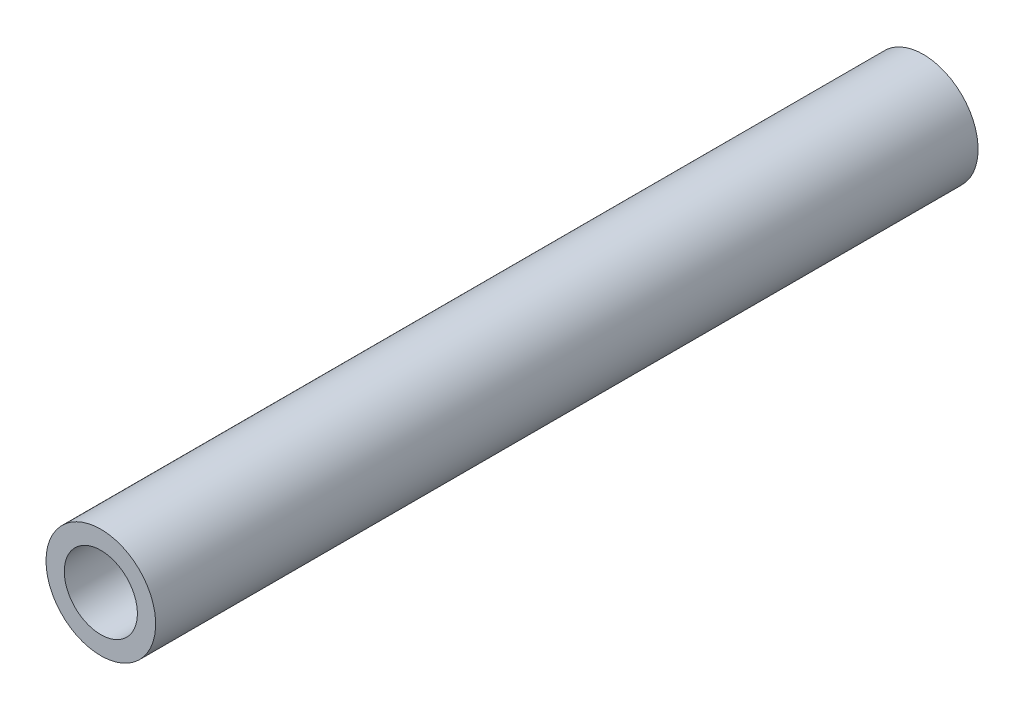
ISO-10303-21;
HEADER;
FILE_DESCRIPTION(('STEP AP214'),'2;1');
FILE_NAME('part.step','',(''),(''),'','','');
FILE_SCHEMA(('AUTOMOTIVE_DESIGN { 1 0 10303 214 1 1 1 1 }'));
ENDSEC;
DATA;
#1=APPLICATION_CONTEXT('core data for automotive mechanical design processes');
#2=APPLICATION_PROTOCOL_DEFINITION('international standard','automotive_design',2000,#1);
#3=PRODUCT_CONTEXT('',#1,'mechanical');
#4=PRODUCT('Part','Part','',(#3));
#5=PRODUCT_RELATED_PRODUCT_CATEGORY('part','',(#4));
#6=PRODUCT_DEFINITION_FORMATION('','',#4);
#7=PRODUCT_DEFINITION_CONTEXT('part definition',#1,'design');
#8=PRODUCT_DEFINITION('design','',#6,#7);
#9=PRODUCT_DEFINITION_SHAPE('','',#8);
#10=(LENGTH_UNIT() NAMED_UNIT(*) SI_UNIT(.MILLI.,.METRE.));
#11=(NAMED_UNIT(*) PLANE_ANGLE_UNIT() SI_UNIT($,.RADIAN.));
#12=(NAMED_UNIT(*) SI_UNIT($,.STERADIAN.) SOLID_ANGLE_UNIT());
#13=UNCERTAINTY_MEASURE_WITH_UNIT(LENGTH_MEASURE(1.E-05),#10,'distance_accuracy_value','');
#14=(GEOMETRIC_REPRESENTATION_CONTEXT(3) GLOBAL_UNCERTAINTY_ASSIGNED_CONTEXT((#13)) GLOBAL_UNIT_ASSIGNED_CONTEXT((#10,
#11,#12)) REPRESENTATION_CONTEXT('',''));
#15=CARTESIAN_POINT('',(0.,0.,0.));
#16=DIRECTION('',(0.,0.,1.));
#17=DIRECTION('',(1.,0.,0.));
#18=AXIS2_PLACEMENT_3D('',#15,#16,#17);
#19=CARTESIAN_POINT('',(0.,0.,22.5));
#20=DIRECTION('',(0.,0.,1.));
#21=DIRECTION('',(1.,0.,0.));
#22=AXIS2_PLACEMENT_3D('',#19,#20,#21);
#23=PLANE('',#22);
#24=CARTESIAN_POINT('',(0.,0.,22.5));
#25=DIRECTION('',(0.,0.,1.));
#26=DIRECTION('',(1.,0.,0.));
#27=AXIS2_PLACEMENT_3D('',#24,#25,#26);
#28=CIRCLE('',#27,3.);
#29=CARTESIAN_POINT('',(-3.,0.,22.5));
#30=VERTEX_POINT('',#29);
#31=EDGE_CURVE('E10',#30,#30,#28,.T.);
#32=ORIENTED_EDGE('',*,*,#31,.T.);
#33=EDGE_LOOP('',(#32));
#34=FACE_BOUND('',#33,.T.);
#35=CARTESIAN_POINT('',(0.,0.,22.5));
#36=DIRECTION('',(0.,0.,1.));
#37=DIRECTION('',(1.,0.,0.));
#38=AXIS2_PLACEMENT_3D('',#35,#36,#37);
#39=CIRCLE('',#38,2.);
#40=CARTESIAN_POINT('',(-2.,0.,22.5));
#41=VERTEX_POINT('',#40);
#42=EDGE_CURVE('E42',#41,#41,#39,.T.);
#43=ORIENTED_EDGE('',*,*,#42,.F.);
#44=EDGE_LOOP('',(#43));
#45=FACE_BOUND('',#44,.T.);
#46=ADVANCED_FACE('F31',(#34,#45),#23,.T.);
#47=CARTESIAN_POINT('',(0.,0.,-22.5));
#48=DIRECTION('',(0.,0.,1.));
#49=DIRECTION('',(1.,0.,0.));
#50=AXIS2_PLACEMENT_3D('',#47,#48,#49);
#51=PLANE('',#50);
#52=CARTESIAN_POINT('',(0.,0.,-22.5));
#53=DIRECTION('',(0.,0.,1.));
#54=DIRECTION('',(1.,0.,0.));
#55=AXIS2_PLACEMENT_3D('',#52,#53,#54);
#56=CIRCLE('',#55,3.);
#57=CARTESIAN_POINT('',(-3.,0.,-22.5));
#58=VERTEX_POINT('',#57);
#59=EDGE_CURVE('E35',#58,#58,#56,.T.);
#60=ORIENTED_EDGE('',*,*,#59,.F.);
#61=EDGE_LOOP('',(#60));
#62=FACE_BOUND('',#61,.T.);
#63=CARTESIAN_POINT('',(0.,0.,-22.5));
#64=DIRECTION('',(0.,0.,1.));
#65=DIRECTION('',(1.,0.,0.));
#66=AXIS2_PLACEMENT_3D('',#63,#64,#65);
#67=CIRCLE('',#66,2.);
#68=CARTESIAN_POINT('',(-2.,0.,-22.5));
#69=VERTEX_POINT('',#68);
#70=EDGE_CURVE('E44',#69,#69,#67,.T.);
#71=ORIENTED_EDGE('',*,*,#70,.T.);
#72=EDGE_LOOP('',(#71));
#73=FACE_BOUND('',#72,.T.);
#74=ADVANCED_FACE('F54',(#62,#73),#51,.F.);
#75=CARTESIAN_POINT('',(0.,0.,22.5));
#76=DIRECTION('',(0.,0.,-1.));
#77=DIRECTION('',(-1.,0.,0.));
#78=AXIS2_PLACEMENT_3D('',#75,#76,#77);
#79=CYLINDRICAL_SURFACE('',#78,3.);
#80=CARTESIAN_POINT('',(-3.,0.,22.5));
#81=CARTESIAN_POINT('',(-3.,0.,22.03125));
#82=CARTESIAN_POINT('',(-3.,0.,21.5625));
#83=CARTESIAN_POINT('',(-3.,0.,20.625));
#84=CARTESIAN_POINT('',(-3.,0.,20.15625));
#85=CARTESIAN_POINT('',(-3.,0.,19.21875));
#86=CARTESIAN_POINT('',(-3.,0.,18.75));
#87=CARTESIAN_POINT('',(-3.,0.,17.8125));
#88=CARTESIAN_POINT('',(-3.,0.,17.34375));
#89=CARTESIAN_POINT('',(-3.,0.,16.40625));
#90=CARTESIAN_POINT('',(-3.,0.,15.9375));
#91=CARTESIAN_POINT('',(-3.,0.,15.));
#92=CARTESIAN_POINT('',(-3.,0.,14.53125));
#93=CARTESIAN_POINT('',(-3.,0.,13.59375));
#94=CARTESIAN_POINT('',(-3.,0.,13.125));
#95=CARTESIAN_POINT('',(-3.,0.,12.1875));
#96=CARTESIAN_POINT('',(-3.,0.,11.71875));
#97=CARTESIAN_POINT('',(-3.,0.,10.78125));
#98=CARTESIAN_POINT('',(-3.,0.,10.3125));
#99=CARTESIAN_POINT('',(-3.,0.,9.37499999999999));
#100=CARTESIAN_POINT('',(-3.,0.,8.90625));
#101=CARTESIAN_POINT('',(-3.,0.,7.96874999999999));
#102=CARTESIAN_POINT('',(-3.,0.,7.5));
#103=CARTESIAN_POINT('',(-3.,0.,6.5625));
#104=CARTESIAN_POINT('',(-3.,0.,6.09374999999999));
#105=CARTESIAN_POINT('',(-3.,0.,5.15624999999999));
#106=CARTESIAN_POINT('',(-3.,0.,4.68749999999999));
#107=CARTESIAN_POINT('',(-3.,0.,3.74999999999999));
#108=CARTESIAN_POINT('',(-3.,0.,3.28124999999999));
#109=CARTESIAN_POINT('',(-3.,0.,2.34375));
#110=CARTESIAN_POINT('',(-3.,0.,1.87499999999999));
#111=CARTESIAN_POINT('',(-3.,0.,0.937499999999994));
#112=CARTESIAN_POINT('',(-3.,0.,0.468749999999993));
#113=CARTESIAN_POINT('',(-3.,0.,-0.468750000000007));
#114=CARTESIAN_POINT('',(-3.,0.,-0.937500000000008));
#115=CARTESIAN_POINT('',(-3.,0.,-1.87500000000001));
#116=CARTESIAN_POINT('',(-3.,0.,-2.34375000000001));
#117=CARTESIAN_POINT('',(-3.,0.,-3.28125000000001));
#118=CARTESIAN_POINT('',(-3.,0.,-3.75000000000001));
#119=CARTESIAN_POINT('',(-3.,0.,-4.68750000000001));
#120=CARTESIAN_POINT('',(-3.,0.,-5.15625000000001));
#121=CARTESIAN_POINT('',(-3.,0.,-6.09375000000001));
#122=CARTESIAN_POINT('',(-3.,0.,-6.56250000000001));
#123=CARTESIAN_POINT('',(-3.,0.,-7.50000000000001));
#124=CARTESIAN_POINT('',(-3.,0.,-7.96875000000001));
#125=CARTESIAN_POINT('',(-3.,0.,-8.90625000000001));
#126=CARTESIAN_POINT('',(-3.,0.,-9.37500000000001));
#127=CARTESIAN_POINT('',(-3.,0.,-10.3125));
#128=CARTESIAN_POINT('',(-3.,0.,-10.78125));
#129=CARTESIAN_POINT('',(-3.,0.,-11.71875));
#130=CARTESIAN_POINT('',(-3.,0.,-12.1875));
#131=CARTESIAN_POINT('',(-3.,0.,-13.125));
#132=CARTESIAN_POINT('',(-3.,0.,-13.59375));
#133=CARTESIAN_POINT('',(-3.,0.,-14.53125));
#134=CARTESIAN_POINT('',(-3.,0.,-15.));
#135=CARTESIAN_POINT('',(-3.,0.,-15.9375));
#136=CARTESIAN_POINT('',(-3.,0.,-16.40625));
#137=CARTESIAN_POINT('',(-3.,0.,-17.34375));
#138=CARTESIAN_POINT('',(-3.,0.,-17.8125));
#139=CARTESIAN_POINT('',(-3.,0.,-18.75));
#140=CARTESIAN_POINT('',(-3.,0.,-19.21875));
#141=CARTESIAN_POINT('',(-3.,0.,-20.15625));
#142=CARTESIAN_POINT('',(-3.,0.,-20.625));
#143=CARTESIAN_POINT('',(-3.,0.,-21.5625));
#144=CARTESIAN_POINT('',(-3.,0.,-22.03125));
#145=CARTESIAN_POINT('',(-3.,0.,-22.5));
#146=B_SPLINE_CURVE_WITH_KNOTS('',3,(#80,#81,#82,#83,#84,#85,#86,#87,#88,#89,#90,#91,#92,#93,
#94,#95,#96,#97,#98,#99,#100,#101,#102,#103,#104,#105,#106,#107,#108,#109,#110,#111,#112,#113,
#114,#115,#116,#117,#118,#119,#120,#121,#122,#123,#124,#125,#126,#127,#128,#129,#130,#131,#132,
#133,#134,#135,#136,#137,#138,#139,#140,#141,#142,#143,#144,#145),.UNSPECIFIED.,.F.,.F.,(4,2,2,
2,2,2,2,2,2,2,2,2,2,2,2,2,2,2,2,2,2,2,2,2,2,2,2,2,2,2,2,2,4),(0.,1.40625,2.8125,4.21875,5.625,
7.03125,8.4375,9.84375,11.25,12.65625,14.0625,15.46875,16.875,18.28125,19.6875,21.09375,22.5,
23.90625,25.3125,26.71875,28.125,29.53125,30.9375,32.34375,33.75,35.15625,36.5625,37.96875,
39.375,40.78125,42.1875,43.59375,45.),.UNSPECIFIED.);
#147=EDGE_CURVE('BSEAM33',#30,#58,#146,.T.);
#148=ORIENTED_EDGE('',*,*,#31,.F.);
#149=ORIENTED_EDGE('',*,*,#59,.T.);
#150=ORIENTED_EDGE('',*,*,#147,.T.);
#151=ORIENTED_EDGE('',*,*,#147,.F.);
#152=EDGE_LOOP('',(#148,#150,#149,#151));
#153=FACE_BOUND('',#152,.T.);
#154=ADVANCED_FACE('F33',(#153),#79,.T.);
#155=CARTESIAN_POINT('',(0.,0.,22.5));
#156=DIRECTION('',(0.,0.,-1.));
#157=DIRECTION('',(-1.,0.,0.));
#158=AXIS2_PLACEMENT_3D('',#155,#156,#157);
#159=CYLINDRICAL_SURFACE('',#158,2.);
#160=CARTESIAN_POINT('',(-2.,0.,22.5));
#161=CARTESIAN_POINT('',(-2.,0.,22.03125));
#162=CARTESIAN_POINT('',(-2.,0.,21.5625));
#163=CARTESIAN_POINT('',(-2.,0.,20.625));
#164=CARTESIAN_POINT('',(-2.,0.,20.15625));
#165=CARTESIAN_POINT('',(-2.,0.,19.21875));
#166=CARTESIAN_POINT('',(-2.,0.,18.75));
#167=CARTESIAN_POINT('',(-2.,0.,17.8125));
#168=CARTESIAN_POINT('',(-2.,0.,17.34375));
#169=CARTESIAN_POINT('',(-2.,0.,16.40625));
#170=CARTESIAN_POINT('',(-2.,0.,15.9375));
#171=CARTESIAN_POINT('',(-2.,0.,15.));
#172=CARTESIAN_POINT('',(-2.,0.,14.53125));
#173=CARTESIAN_POINT('',(-2.,0.,13.59375));
#174=CARTESIAN_POINT('',(-2.,0.,13.125));
#175=CARTESIAN_POINT('',(-2.,0.,12.1875));
#176=CARTESIAN_POINT('',(-2.,0.,11.71875));
#177=CARTESIAN_POINT('',(-2.,0.,10.78125));
#178=CARTESIAN_POINT('',(-2.,0.,10.3125));
#179=CARTESIAN_POINT('',(-2.,0.,9.37499999999999));
#180=CARTESIAN_POINT('',(-2.,0.,8.90625));
#181=CARTESIAN_POINT('',(-2.,0.,7.96874999999999));
#182=CARTESIAN_POINT('',(-2.,0.,7.5));
#183=CARTESIAN_POINT('',(-2.,0.,6.5625));
#184=CARTESIAN_POINT('',(-2.,0.,6.09375));
#185=CARTESIAN_POINT('',(-2.,0.,5.15625));
#186=CARTESIAN_POINT('',(-2.,0.,4.6875));
#187=CARTESIAN_POINT('',(-2.,0.,3.75));
#188=CARTESIAN_POINT('',(-2.,0.,3.28125));
#189=CARTESIAN_POINT('',(-2.,0.,2.34375));
#190=CARTESIAN_POINT('',(-2.,0.,1.875));
#191=CARTESIAN_POINT('',(-2.,0.,0.937499999999997));
#192=CARTESIAN_POINT('',(-2.,0.,0.468749999999997));
#193=CARTESIAN_POINT('',(-2.,0.,-0.468750000000004));
#194=CARTESIAN_POINT('',(-2.,0.,-0.937500000000004));
#195=CARTESIAN_POINT('',(-2.,0.,-1.87500000000001));
#196=CARTESIAN_POINT('',(-2.,0.,-2.34375000000001));
#197=CARTESIAN_POINT('',(-2.,0.,-3.28125));
#198=CARTESIAN_POINT('',(-2.,0.,-3.75));
#199=CARTESIAN_POINT('',(-2.,0.,-4.6875));
#200=CARTESIAN_POINT('',(-2.,0.,-5.15625));
#201=CARTESIAN_POINT('',(-2.,0.,-6.09375000000001));
#202=CARTESIAN_POINT('',(-2.,0.,-6.56250000000001));
#203=CARTESIAN_POINT('',(-2.,0.,-7.50000000000001));
#204=CARTESIAN_POINT('',(-2.,0.,-7.96875000000001));
#205=CARTESIAN_POINT('',(-2.,0.,-8.90625));
#206=CARTESIAN_POINT('',(-2.,0.,-9.37500000000001));
#207=CARTESIAN_POINT('',(-2.,0.,-10.3125));
#208=CARTESIAN_POINT('',(-2.,0.,-10.78125));
#209=CARTESIAN_POINT('',(-2.,0.,-11.71875));
#210=CARTESIAN_POINT('',(-2.,0.,-12.1875));
#211=CARTESIAN_POINT('',(-2.,0.,-13.125));
#212=CARTESIAN_POINT('',(-2.,0.,-13.59375));
#213=CARTESIAN_POINT('',(-2.,0.,-14.53125));
#214=CARTESIAN_POINT('',(-2.,0.,-15.));
#215=CARTESIAN_POINT('',(-2.,0.,-15.9375));
#216=CARTESIAN_POINT('',(-2.,0.,-16.40625));
#217=CARTESIAN_POINT('',(-2.,0.,-17.34375));
#218=CARTESIAN_POINT('',(-2.,0.,-17.8125));
#219=CARTESIAN_POINT('',(-2.,0.,-18.75));
#220=CARTESIAN_POINT('',(-2.,0.,-19.21875));
#221=CARTESIAN_POINT('',(-2.,0.,-20.15625));
#222=CARTESIAN_POINT('',(-2.,0.,-20.625));
#223=CARTESIAN_POINT('',(-2.,0.,-21.5625));
#224=CARTESIAN_POINT('',(-2.,0.,-22.03125));
#225=CARTESIAN_POINT('',(-2.,0.,-22.5));
#226=B_SPLINE_CURVE_WITH_KNOTS('',3,(#160,#161,#162,#163,#164,#165,#166,#167,#168,#169,#170,
#171,#172,#173,#174,#175,#176,#177,#178,#179,#180,#181,#182,#183,#184,#185,#186,#187,#188,#189,
#190,#191,#192,#193,#194,#195,#196,#197,#198,#199,#200,#201,#202,#203,#204,#205,#206,#207,#208,
#209,#210,#211,#212,#213,#214,#215,#216,#217,#218,#219,#220,#221,#222,#223,#224,#225),
.UNSPECIFIED.,.F.,.F.,(4,2,2,2,2,2,2,2,2,2,2,2,2,2,2,2,2,2,2,2,2,2,2,2,2,2,2,2,2,2,2,2,4),(0.,
1.40625,2.8125,4.21875,5.625,7.03125,8.4375,9.84375,11.25,12.65625,14.0625,15.46875,16.875,
18.28125,19.6875,21.09375,22.5,23.90625,25.3125,26.71875,28.125,29.53125,30.9375,32.34375,33.75,
35.15625,36.5625,37.96875,39.375,40.78125,42.1875,43.59375,45.),.UNSPECIFIED.);
#227=EDGE_CURVE('BSEAM50',#41,#69,#226,.T.);
#228=ORIENTED_EDGE('',*,*,#42,.T.);
#229=ORIENTED_EDGE('',*,*,#70,.F.);
#230=ORIENTED_EDGE('',*,*,#227,.T.);
#231=ORIENTED_EDGE('',*,*,#227,.F.);
#232=EDGE_LOOP('',(#228,#230,#229,#231));
#233=FACE_BOUND('',#232,.T.);
#234=ADVANCED_FACE('F50',(#233),#159,.F.);
#235=CLOSED_SHELL('',(#46,#74,#154,#234));
#236=MANIFOLD_SOLID_BREP('B2',#235);
#237=ADVANCED_BREP_SHAPE_REPRESENTATION('',(#18,#236),#14);
#238=SHAPE_DEFINITION_REPRESENTATION(#9,#237);
ENDSEC;
END-ISO-10303-21;
